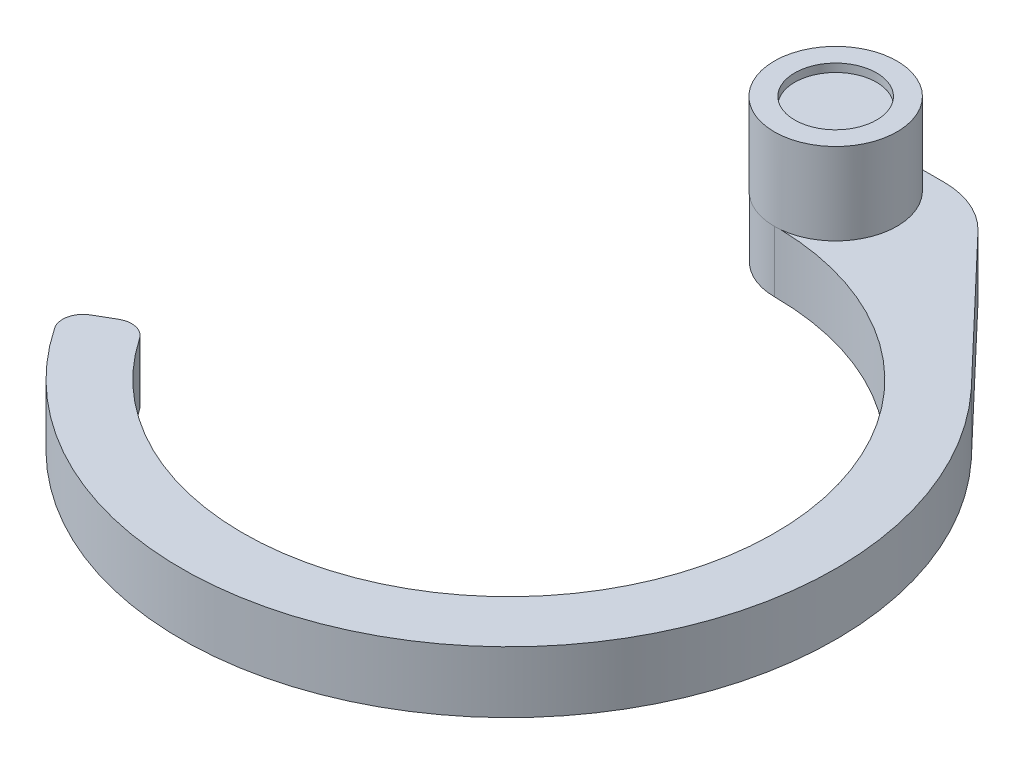
ISO-10303-21;
HEADER;
FILE_DESCRIPTION(('STEP AP214'),'2;1');
FILE_NAME('part.step','',(''),(''),'','','');
FILE_SCHEMA(('AUTOMOTIVE_DESIGN { 1 0 10303 214 1 1 1 1 }'));
ENDSEC;
DATA;
#1=APPLICATION_CONTEXT('core data for automotive mechanical design processes');
#2=APPLICATION_PROTOCOL_DEFINITION('international standard','automotive_design',2000,#1);
#3=PRODUCT_CONTEXT('',#1,'mechanical');
#4=PRODUCT('Part','Part','',(#3));
#5=PRODUCT_RELATED_PRODUCT_CATEGORY('part','',(#4));
#6=PRODUCT_DEFINITION_FORMATION('','',#4);
#7=PRODUCT_DEFINITION_CONTEXT('part definition',#1,'design');
#8=PRODUCT_DEFINITION('design','',#6,#7);
#9=PRODUCT_DEFINITION_SHAPE('','',#8);
#10=(LENGTH_UNIT() NAMED_UNIT(*) SI_UNIT(.MILLI.,.METRE.));
#11=(NAMED_UNIT(*) PLANE_ANGLE_UNIT() SI_UNIT($,.RADIAN.));
#12=(NAMED_UNIT(*) SI_UNIT($,.STERADIAN.) SOLID_ANGLE_UNIT());
#13=UNCERTAINTY_MEASURE_WITH_UNIT(LENGTH_MEASURE(1.E-05),#10,'distance_accuracy_value','');
#14=(GEOMETRIC_REPRESENTATION_CONTEXT(3) GLOBAL_UNCERTAINTY_ASSIGNED_CONTEXT((#13)) GLOBAL_UNIT_ASSIGNED_CONTEXT((#10,
#11,#12)) REPRESENTATION_CONTEXT('',''));
#15=CARTESIAN_POINT('',(0.,0.,0.));
#16=DIRECTION('',(0.,0.,1.));
#17=DIRECTION('',(1.,0.,0.));
#18=AXIS2_PLACEMENT_3D('',#15,#16,#17);
#19=CARTESIAN_POINT('',(-62.3074069840787,15.,41.7467008866615));
#20=DIRECTION('',(0.,-1.,0.));
#21=DIRECTION('',(0.,0.,-1.));
#22=AXIS2_PLACEMENT_3D('',#19,#20,#21);
#23=CYLINDRICAL_SURFACE('',#22,5.00000000000001);
#24=CARTESIAN_POINT('',(-62.3074069840787,0.,41.7467008866615));
#25=DIRECTION('',(0.,1.,0.));
#26=DIRECTION('',(0.,0.,1.));
#27=AXIS2_PLACEMENT_3D('',#24,#25,#26);
#28=CIRCLE('',#27,5.00000000000001);
#29=CARTESIAN_POINT('',(-66.4612341163506,0.,44.5298142791056));
#30=VERTEX_POINT('',#29);
#31=CARTESIAN_POINT('',(-64.8074069840787,0.,37.4165738677393));
#32=VERTEX_POINT('',#31);
#33=EDGE_CURVE('E139',#30,#32,#28,.F.);
#34=ORIENTED_EDGE('',*,*,#33,.F.);
#35=DIRECTION('',(0.,-1.,0.));
#36=VECTOR('',#35,1.);
#37=CARTESIAN_POINT('',(-66.4612341163506,15.,44.5298142791056));
#38=LINE('',#37,#36);
#39=CARTESIAN_POINT('',(-66.4612341163506,15.,44.5298142791056));
#40=VERTEX_POINT('',#39);
#41=EDGE_CURVE('E11',#40,#30,#38,.T.);
#42=ORIENTED_EDGE('',*,*,#41,.F.);
#43=CARTESIAN_POINT('',(-62.3074069840787,15.,41.7467008866615));
#44=DIRECTION('',(0.,1.,0.));
#45=DIRECTION('',(0.,0.,1.));
#46=AXIS2_PLACEMENT_3D('',#43,#44,#45);
#47=CIRCLE('',#46,5.00000000000001);
#48=CARTESIAN_POINT('',(-64.8074069840787,15.,37.4165738677393));
#49=VERTEX_POINT('',#48);
#50=EDGE_CURVE('E163',#40,#49,#47,.F.);
#51=ORIENTED_EDGE('',*,*,#50,.T.);
#52=DIRECTION('',(0.,-1.,0.));
#53=VECTOR('',#52,1.);
#54=CARTESIAN_POINT('',(-64.8074069840787,15.,37.4165738677393));
#55=LINE('',#54,#53);
#56=EDGE_CURVE('E90',#49,#32,#55,.T.);
#57=ORIENTED_EDGE('',*,*,#56,.T.);
#58=EDGE_LOOP('',(#34,#42,#51,#57));
#59=FACE_BOUND('',#58,.T.);
#60=ADVANCED_FACE('F33',(#59),#23,.T.);
#61=CARTESIAN_POINT('',(0.,15.,0.));
#62=DIRECTION('',(0.,-1.,0.));
#63=DIRECTION('',(0.,0.,-1.));
#64=AXIS2_PLACEMENT_3D('',#61,#62,#63);
#65=CYLINDRICAL_SURFACE('',#64,80.);
#66=CARTESIAN_POINT('',(0.,0.,0.));
#67=DIRECTION('',(0.,1.,0.));
#68=DIRECTION('',(0.,0.,1.));
#69=AXIS2_PLACEMENT_3D('',#66,#67,#68);
#70=CIRCLE('',#69,80.);
#71=CARTESIAN_POINT('',(58.5757297296054,0.,-54.4874654085159));
#72=VERTEX_POINT('',#71);
#73=EDGE_CURVE('E142',#30,#72,#70,.T.);
#74=ORIENTED_EDGE('',*,*,#73,.T.);
#75=DIRECTION('',(0.,-1.,0.));
#76=VECTOR('',#75,1.);
#77=CARTESIAN_POINT('',(58.5757297296054,15.,-54.4874654085159));
#78=LINE('',#77,#76);
#79=CARTESIAN_POINT('',(58.5757297296054,15.,-54.4874654085159));
#80=VERTEX_POINT('',#79);
#81=EDGE_CURVE('E40',#80,#72,#78,.T.);
#82=ORIENTED_EDGE('',*,*,#81,.F.);
#83=CARTESIAN_POINT('',(0.,15.,0.));
#84=DIRECTION('',(0.,1.,0.));
#85=DIRECTION('',(0.,0.,1.));
#86=AXIS2_PLACEMENT_3D('',#83,#84,#85);
#87=CIRCLE('',#86,80.);
#88=EDGE_CURVE('E194',#40,#80,#87,.T.);
#89=ORIENTED_EDGE('',*,*,#88,.F.);
#90=ORIENTED_EDGE('',*,*,#41,.T.);
#91=EDGE_LOOP('',(#74,#82,#89,#90));
#92=FACE_BOUND('',#91,.T.);
#93=ADVANCED_FACE('F181',(#92),#65,.T.);
#94=CARTESIAN_POINT('',(57.9325504327501,15.,-55.1629373618664));
#95=DIRECTION('',(0.724206102182212,0.,-0.689583585623996));
#96=DIRECTION('',(-0.689583585623996,0.,-0.724206102182212));
#97=AXIS2_PLACEMENT_3D('',#94,#95,#96);
#98=PLANE('',#97);
#99=DIRECTION('',(0.689583585623996,0.,0.724206102182212));
#100=VECTOR('',#99,1.);
#101=CARTESIAN_POINT('',(57.9325504327501,0.,-55.1629373618664));
#102=LINE('',#101,#100);
#103=CARTESIAN_POINT('',(25.911523347206,0.,-88.7916717124799));
#104=VERTEX_POINT('',#103);
#105=EDGE_CURVE('E146',#104,#72,#102,.T.);
#106=ORIENTED_EDGE('',*,*,#105,.F.);
#107=DIRECTION('',(0.,-1.,0.));
#108=VECTOR('',#107,1.);
#109=CARTESIAN_POINT('',(25.911523347206,15.,-88.7916717124799));
#110=LINE('',#109,#108);
#111=CARTESIAN_POINT('',(25.911523347206,15.,-88.7916717124799));
#112=VERTEX_POINT('',#111);
#113=EDGE_CURVE('E171',#112,#104,#110,.T.);
#114=ORIENTED_EDGE('',*,*,#113,.F.);
#115=DIRECTION('',(0.689583585623996,0.,0.724206102182212));
#116=VECTOR('',#115,1.);
#117=CARTESIAN_POINT('',(57.9325504327501,15.,-55.1629373618664));
#118=LINE('',#117,#116);
#119=EDGE_CURVE('E178',#112,#80,#118,.T.);
#120=ORIENTED_EDGE('',*,*,#119,.T.);
#121=ORIENTED_EDGE('',*,*,#81,.T.);
#122=EDGE_LOOP('',(#106,#114,#120,#121));
#123=FACE_BOUND('',#122,.T.);
#124=ADVANCED_FACE('F176',(#123),#98,.T.);
#125=CARTESIAN_POINT('',(11.4274013035615,15.,-75.));
#126=DIRECTION('',(0.,-1.,0.));
#127=DIRECTION('',(0.,0.,-1.));
#128=AXIS2_PLACEMENT_3D('',#125,#126,#127);
#129=CYLINDRICAL_SURFACE('',#128,20.0000000000001);
#130=CARTESIAN_POINT('',(11.4274013035615,0.,-75.));
#131=DIRECTION('',(0.,1.,0.));
#132=DIRECTION('',(0.,0.,1.));
#133=AXIS2_PLACEMENT_3D('',#130,#131,#132);
#134=CIRCLE('',#133,20.0000000000001);
#135=CARTESIAN_POINT('',(11.4274013035618,0.,-95.));
#136=VERTEX_POINT('',#135);
#137=EDGE_CURVE('E149',#136,#104,#134,.F.);
#138=ORIENTED_EDGE('',*,*,#137,.F.);
#139=DIRECTION('',(0.,-1.,0.));
#140=VECTOR('',#139,1.);
#141=CARTESIAN_POINT('',(11.4274013035618,15.,-95.));
#142=LINE('',#141,#140);
#143=CARTESIAN_POINT('',(11.4274013035618,15.,-95.));
#144=VERTEX_POINT('',#143);
#145=EDGE_CURVE('E169',#144,#136,#142,.T.);
#146=ORIENTED_EDGE('',*,*,#145,.F.);
#147=CARTESIAN_POINT('',(11.4274013035615,15.,-75.));
#148=DIRECTION('',(0.,1.,0.));
#149=DIRECTION('',(0.,0.,1.));
#150=AXIS2_PLACEMENT_3D('',#147,#148,#149);
#151=CIRCLE('',#150,20.0000000000001);
#152=EDGE_CURVE('E191',#144,#112,#151,.F.);
#153=ORIENTED_EDGE('',*,*,#152,.T.);
#154=ORIENTED_EDGE('',*,*,#113,.T.);
#155=EDGE_LOOP('',(#138,#146,#153,#154));
#156=FACE_BOUND('',#155,.T.);
#157=ADVANCED_FACE('F188',(#156),#129,.T.);
#158=CARTESIAN_POINT('',(-1.15370923512719E-13,15.,-95.));
#159=DIRECTION('',(0.,0.,-1.));
#160=DIRECTION('',(-1.,0.,0.));
#161=AXIS2_PLACEMENT_3D('',#158,#159,#160);
#162=PLANE('',#161);
#163=DIRECTION('',(1.,0.,0.));
#164=VECTOR('',#163,1.);
#165=CARTESIAN_POINT('',(-1.15370923512719E-13,0.,-95.));
#166=LINE('',#165,#164);
#167=CARTESIAN_POINT('',(0.,0.,-95.));
#168=VERTEX_POINT('',#167);
#169=EDGE_CURVE('E152',#168,#136,#166,.T.);
#170=ORIENTED_EDGE('',*,*,#169,.F.);
#171=DIRECTION('',(0.,-1.,0.));
#172=VECTOR('',#171,1.);
#173=CARTESIAN_POINT('',(0.,15.,-95.));
#174=LINE('',#173,#172);
#175=CARTESIAN_POINT('',(0.,15.,-95.));
#176=VERTEX_POINT('',#175);
#177=EDGE_CURVE('E167',#176,#168,#174,.T.);
#178=ORIENTED_EDGE('',*,*,#177,.F.);
#179=DIRECTION('',(1.,0.,0.));
#180=VECTOR('',#179,1.);
#181=CARTESIAN_POINT('',(-1.15370923512719E-13,15.,-95.));
#182=LINE('',#181,#180);
#183=EDGE_CURVE('E196',#176,#144,#182,.T.);
#184=ORIENTED_EDGE('',*,*,#183,.T.);
#185=ORIENTED_EDGE('',*,*,#145,.T.);
#186=EDGE_LOOP('',(#170,#178,#184,#185));
#187=FACE_BOUND('',#186,.T.);
#188=ADVANCED_FACE('F231',(#187),#162,.T.);
#189=CARTESIAN_POINT('',(0.,15.,-80.));
#190=DIRECTION('',(0.,-1.,0.));
#191=DIRECTION('',(0.,0.,-1.));
#192=AXIS2_PLACEMENT_3D('',#189,#190,#191);
#193=CYLINDRICAL_SURFACE('',#192,15.);
#194=CARTESIAN_POINT('',(0.,0.,-80.));
#195=DIRECTION('',(0.,1.,0.));
#196=DIRECTION('',(0.,0.,1.));
#197=AXIS2_PLACEMENT_3D('',#194,#195,#196);
#198=CIRCLE('',#197,15.);
#199=CARTESIAN_POINT('',(0.,0.,-65.));
#200=VERTEX_POINT('',#199);
#201=EDGE_CURVE('E155',#168,#200,#198,.T.);
#202=ORIENTED_EDGE('',*,*,#201,.T.);
#203=DIRECTION('',(0.,-1.,0.));
#204=VECTOR('',#203,1.);
#205=CARTESIAN_POINT('',(0.,15.,-65.));
#206=LINE('',#205,#204);
#207=CARTESIAN_POINT('',(0.,15.,-65.));
#208=VERTEX_POINT('',#207);
#209=EDGE_CURVE('E123',#208,#200,#206,.T.);
#210=ORIENTED_EDGE('',*,*,#209,.F.);
#211=CARTESIAN_POINT('',(0.,15.,-80.));
#212=DIRECTION('',(0.,1.,0.));
#213=DIRECTION('',(0.,0.,1.));
#214=AXIS2_PLACEMENT_3D('',#211,#212,#213);
#215=CIRCLE('',#214,15.);
#216=CARTESIAN_POINT('',(-14.9999274475423,15.,-79.9533462920227));
#217=VERTEX_POINT('',#216);
#218=EDGE_CURVE('E200',#217,#208,#215,.T.);
#219=ORIENTED_EDGE('',*,*,#218,.F.);
#220=EDGE_CURVE('E134',#176,#217,#215,.T.);
#221=ORIENTED_EDGE('',*,*,#220,.F.);
#222=ORIENTED_EDGE('',*,*,#177,.T.);
#223=EDGE_LOOP('',(#202,#210,#219,#221,#222));
#224=FACE_BOUND('',#223,.T.);
#225=ADVANCED_FACE('F209',(#224),#193,.T.);
#226=CARTESIAN_POINT('',(0.,15.,0.));
#227=DIRECTION('',(0.,-1.,0.));
#228=DIRECTION('',(0.,0.,-1.));
#229=AXIS2_PLACEMENT_3D('',#226,#227,#228);
#230=CYLINDRICAL_SURFACE('',#229,65.);
#231=CARTESIAN_POINT('',(0.,0.,0.));
#232=DIRECTION('',(0.,1.,0.));
#233=DIRECTION('',(0.,0.,1.));
#234=AXIS2_PLACEMENT_3D('',#231,#232,#233);
#235=CIRCLE('',#234,65.);
#236=CARTESIAN_POINT('',(-53.8264378899364,0.,36.4378180477484));
#237=VERTEX_POINT('',#236);
#238=EDGE_CURVE('E120',#237,#200,#235,.T.);
#239=ORIENTED_EDGE('',*,*,#238,.F.);
#240=DIRECTION('',(0.,-1.,0.));
#241=VECTOR('',#240,1.);
#242=CARTESIAN_POINT('',(-53.8264378899364,15.,36.4378180477484));
#243=LINE('',#242,#241);
#244=CARTESIAN_POINT('',(-53.8264378899364,15.,36.4378180477484));
#245=VERTEX_POINT('',#244);
#246=EDGE_CURVE('E114',#245,#237,#243,.T.);
#247=ORIENTED_EDGE('',*,*,#246,.F.);
#248=CARTESIAN_POINT('',(0.,15.,0.));
#249=DIRECTION('',(0.,1.,0.));
#250=DIRECTION('',(0.,0.,1.));
#251=AXIS2_PLACEMENT_3D('',#248,#249,#250);
#252=CIRCLE('',#251,65.);
#253=CARTESIAN_POINT('',(1.50653146564037,15.,-64.9825389081024));
#254=VERTEX_POINT('',#253);
#255=EDGE_CURVE('E117',#245,#254,#252,.T.);
#256=ORIENTED_EDGE('',*,*,#255,.T.);
#257=EDGE_CURVE('E132',#254,#208,#252,.T.);
#258=ORIENTED_EDGE('',*,*,#257,.T.);
#259=ORIENTED_EDGE('',*,*,#209,.T.);
#260=EDGE_LOOP('',(#239,#247,#256,#258,#259));
#261=FACE_BOUND('',#260,.T.);
#262=ADVANCED_FACE('F116',(#261),#230,.F.);
#263=CARTESIAN_POINT('',(-57.9669331122392,15.,39.2407271283444));
#264=DIRECTION('',(0.,-1.,0.));
#265=DIRECTION('',(0.,0.,-1.));
#266=AXIS2_PLACEMENT_3D('',#263,#264,#265);
#267=CYLINDRICAL_SURFACE('',#266,5.);
#268=CARTESIAN_POINT('',(-57.9669331122392,0.,39.2407271283444));
#269=DIRECTION('',(0.,1.,0.));
#270=DIRECTION('',(0.,0.,1.));
#271=AXIS2_PLACEMENT_3D('',#268,#269,#270);
#272=CIRCLE('',#271,5.);
#273=CARTESIAN_POINT('',(-60.4669331122392,0.,34.9106001094222));
#274=VERTEX_POINT('',#273);
#275=EDGE_CURVE('E159',#237,#274,#272,.T.);
#276=ORIENTED_EDGE('',*,*,#275,.T.);
#277=DIRECTION('',(0.,-1.,0.));
#278=VECTOR('',#277,1.);
#279=CARTESIAN_POINT('',(-60.4669331122392,15.,34.9106001094222));
#280=LINE('',#279,#278);
#281=CARTESIAN_POINT('',(-60.4669331122392,15.,34.9106001094222));
#282=VERTEX_POINT('',#281);
#283=EDGE_CURVE('E124',#282,#274,#280,.T.);
#284=ORIENTED_EDGE('',*,*,#283,.F.);
#285=CARTESIAN_POINT('',(-57.9669331122392,15.,39.2407271283444));
#286=DIRECTION('',(0.,1.,0.));
#287=DIRECTION('',(0.,0.,1.));
#288=AXIS2_PLACEMENT_3D('',#285,#286,#287);
#289=CIRCLE('',#288,5.);
#290=EDGE_CURVE('E127',#245,#282,#289,.T.);
#291=ORIENTED_EDGE('',*,*,#290,.F.);
#292=ORIENTED_EDGE('',*,*,#246,.T.);
#293=EDGE_LOOP('',(#276,#284,#291,#292));
#294=FACE_BOUND('',#293,.T.);
#295=ADVANCED_FACE('F128',(#294),#267,.T.);
#296=CARTESIAN_POINT('',(0.,15.,0.));
#297=DIRECTION('',(0.499999999999997,0.,0.86602540378444));
#298=DIRECTION('',(0.86602540378444,0.,-0.499999999999997));
#299=AXIS2_PLACEMENT_3D('',#296,#297,#298);
#300=PLANE('',#299);
#301=DIRECTION('',(-0.86602540378444,0.,0.499999999999997));
#302=VECTOR('',#301,1.);
#303=CARTESIAN_POINT('',(0.,0.,0.));
#304=LINE('',#303,#302);
#305=EDGE_CURVE('E161',#274,#32,#304,.T.);
#306=ORIENTED_EDGE('',*,*,#305,.T.);
#307=ORIENTED_EDGE('',*,*,#56,.F.);
#308=DIRECTION('',(-0.86602540378444,0.,0.499999999999997));
#309=VECTOR('',#308,1.);
#310=CARTESIAN_POINT('',(0.,15.,0.));
#311=LINE('',#310,#309);
#312=EDGE_CURVE('E55',#282,#49,#311,.T.);
#313=ORIENTED_EDGE('',*,*,#312,.F.);
#314=ORIENTED_EDGE('',*,*,#283,.T.);
#315=EDGE_LOOP('',(#306,#307,#313,#314));
#316=FACE_BOUND('',#315,.T.);
#317=ADVANCED_FACE('F240',(#316),#300,.F.);
#318=CARTESIAN_POINT('',(0.,15.,0.));
#319=DIRECTION('',(0.,1.,0.));
#320=DIRECTION('',(0.,0.,1.));
#321=AXIS2_PLACEMENT_3D('',#318,#319,#320);
#322=PLANE('',#321);
#323=CARTESIAN_POINT('',(0.,15.,-79.906692584041));
#324=DIRECTION('',(0.,1.,0.));
#325=DIRECTION('',(0.,0.,1.));
#326=AXIS2_PLACEMENT_3D('',#323,#324,#325);
#327=CIRCLE('',#326,15.);
#328=EDGE_CURVE('E47',#254,#217,#327,.T.);
#329=ORIENTED_EDGE('',*,*,#328,.F.);
#330=ORIENTED_EDGE('',*,*,#255,.F.);
#331=ORIENTED_EDGE('',*,*,#290,.T.);
#332=ORIENTED_EDGE('',*,*,#312,.T.);
#333=ORIENTED_EDGE('',*,*,#50,.F.);
#334=ORIENTED_EDGE('',*,*,#88,.T.);
#335=ORIENTED_EDGE('',*,*,#119,.F.);
#336=ORIENTED_EDGE('',*,*,#152,.F.);
#337=ORIENTED_EDGE('',*,*,#183,.F.);
#338=ORIENTED_EDGE('',*,*,#220,.T.);
#339=EDGE_LOOP('',(#329,#330,#331,#332,#333,#334,#335,#336,#337,#338));
#340=FACE_BOUND('',#339,.T.);
#341=ADVANCED_FACE('F131',(#340),#322,.T.);
#342=CARTESIAN_POINT('',(0.,0.,0.));
#343=DIRECTION('',(0.,1.,0.));
#344=DIRECTION('',(0.,0.,1.));
#345=AXIS2_PLACEMENT_3D('',#342,#343,#344);
#346=PLANE('',#345);
#347=ORIENTED_EDGE('',*,*,#33,.T.);
#348=ORIENTED_EDGE('',*,*,#305,.F.);
#349=ORIENTED_EDGE('',*,*,#275,.F.);
#350=ORIENTED_EDGE('',*,*,#238,.T.);
#351=ORIENTED_EDGE('',*,*,#201,.F.);
#352=ORIENTED_EDGE('',*,*,#169,.T.);
#353=ORIENTED_EDGE('',*,*,#137,.T.);
#354=ORIENTED_EDGE('',*,*,#105,.T.);
#355=ORIENTED_EDGE('',*,*,#73,.F.);
#356=EDGE_LOOP('',(#347,#348,#349,#350,#351,#352,#353,#354,#355));
#357=FACE_BOUND('',#356,.T.);
#358=ADVANCED_FACE('F183',(#357),#346,.F.);
#359=CARTESIAN_POINT('',(0.,15.,-79.906692584041));
#360=DIRECTION('',(0.,1.,0.));
#361=DIRECTION('',(0.,0.,1.));
#362=AXIS2_PLACEMENT_3D('',#359,#360,#361);
#363=PLANE('',#362);
#364=EDGE_CURVE('E211',#217,#254,#327,.T.);
#365=ORIENTED_EDGE('',*,*,#364,.F.);
#366=ORIENTED_EDGE('',*,*,#218,.T.);
#367=ORIENTED_EDGE('',*,*,#257,.F.);
#368=EDGE_LOOP('',(#365,#366,#367));
#369=FACE_BOUND('',#368,.T.);
#370=ADVANCED_FACE('F212',(#369),#363,.F.);
#371=CARTESIAN_POINT('',(0.,35.,-79.906692584041));
#372=DIRECTION('',(0.,-1.,0.));
#373=DIRECTION('',(0.,0.,-1.));
#374=AXIS2_PLACEMENT_3D('',#371,#372,#373);
#375=CYLINDRICAL_SURFACE('',#374,15.);
#376=CARTESIAN_POINT('',(0.,35.,-79.906692584041));
#377=DIRECTION('',(0.,1.,0.));
#378=DIRECTION('',(0.,0.,1.));
#379=AXIS2_PLACEMENT_3D('',#376,#377,#378);
#380=CIRCLE('',#379,15.);
#381=CARTESIAN_POINT('',(0.,35.,-64.906692584041));
#382=VERTEX_POINT('',#381);
#383=EDGE_CURVE('E143',#382,#382,#380,.T.);
#384=ORIENTED_EDGE('',*,*,#383,.F.);
#385=EDGE_LOOP('',(#384));
#386=FACE_BOUND('',#385,.T.);
#387=ORIENTED_EDGE('',*,*,#328,.T.);
#388=ORIENTED_EDGE('',*,*,#364,.T.);
#389=EDGE_LOOP('',(#387,#388));
#390=FACE_BOUND('',#389,.T.);
#391=ADVANCED_FACE('F216',(#386,#390),#375,.T.);
#392=CARTESIAN_POINT('',(0.,35.,-79.906692584041));
#393=DIRECTION('',(0.,1.,0.));
#394=DIRECTION('',(0.,0.,1.));
#395=AXIS2_PLACEMENT_3D('',#392,#393,#394);
#396=PLANE('',#395);
#397=CARTESIAN_POINT('',(0.,35.,-79.906692584041));
#398=DIRECTION('',(0.,1.,0.));
#399=DIRECTION('',(0.,0.,1.));
#400=AXIS2_PLACEMENT_3D('',#397,#398,#399);
#401=CIRCLE('',#400,10.);
#402=CARTESIAN_POINT('',(0.,35.,-69.906692584041));
#403=VERTEX_POINT('',#402);
#404=EDGE_CURVE('E268',#403,#403,#401,.T.);
#405=ORIENTED_EDGE('',*,*,#404,.F.);
#406=EDGE_LOOP('',(#405));
#407=FACE_BOUND('',#406,.T.);
#408=ORIENTED_EDGE('',*,*,#383,.T.);
#409=EDGE_LOOP('',(#408));
#410=FACE_BOUND('',#409,.T.);
#411=ADVANCED_FACE('F250',(#407,#410),#396,.T.);
#412=CARTESIAN_POINT('',(0.,33.,-79.906692584041));
#413=DIRECTION('',(0.,1.,0.));
#414=DIRECTION('',(0.,0.,1.));
#415=AXIS2_PLACEMENT_3D('',#412,#413,#414);
#416=CYLINDRICAL_SURFACE('',#415,10.);
#417=CARTESIAN_POINT('',(0.,33.,-79.906692584041));
#418=DIRECTION('',(0.,1.,0.));
#419=DIRECTION('',(0.,0.,1.));
#420=AXIS2_PLACEMENT_3D('',#417,#418,#419);
#421=CIRCLE('',#420,10.);
#422=CARTESIAN_POINT('',(0.,33.,-69.906692584041));
#423=VERTEX_POINT('',#422);
#424=EDGE_CURVE('E214',#423,#423,#421,.T.);
#425=ORIENTED_EDGE('',*,*,#424,.F.);
#426=EDGE_LOOP('',(#425));
#427=FACE_BOUND('',#426,.T.);
#428=ORIENTED_EDGE('',*,*,#404,.T.);
#429=EDGE_LOOP('',(#428));
#430=FACE_BOUND('',#429,.T.);
#431=ADVANCED_FACE('F256',(#427,#430),#416,.F.);
#432=CARTESIAN_POINT('',(0.,33.,-79.906692584041));
#433=DIRECTION('',(0.,1.,0.));
#434=DIRECTION('',(0.,0.,1.));
#435=AXIS2_PLACEMENT_3D('',#432,#433,#434);
#436=PLANE('',#435);
#437=ORIENTED_EDGE('',*,*,#424,.T.);
#438=EDGE_LOOP('',(#437));
#439=FACE_BOUND('',#438,.T.);
#440=ADVANCED_FACE('F260',(#439),#436,.T.);
#441=CLOSED_SHELL('',(#60,#93,#124,#157,#188,#225,#262,#295,#317,#341,#358,#370,#391,#411,#431,#440));
#442=MANIFOLD_SOLID_BREP('B2',#441);
#443=ADVANCED_BREP_SHAPE_REPRESENTATION('',(#18,#442),#14);
#444=SHAPE_DEFINITION_REPRESENTATION(#9,#443);
ENDSEC;
END-ISO-10303-21;
